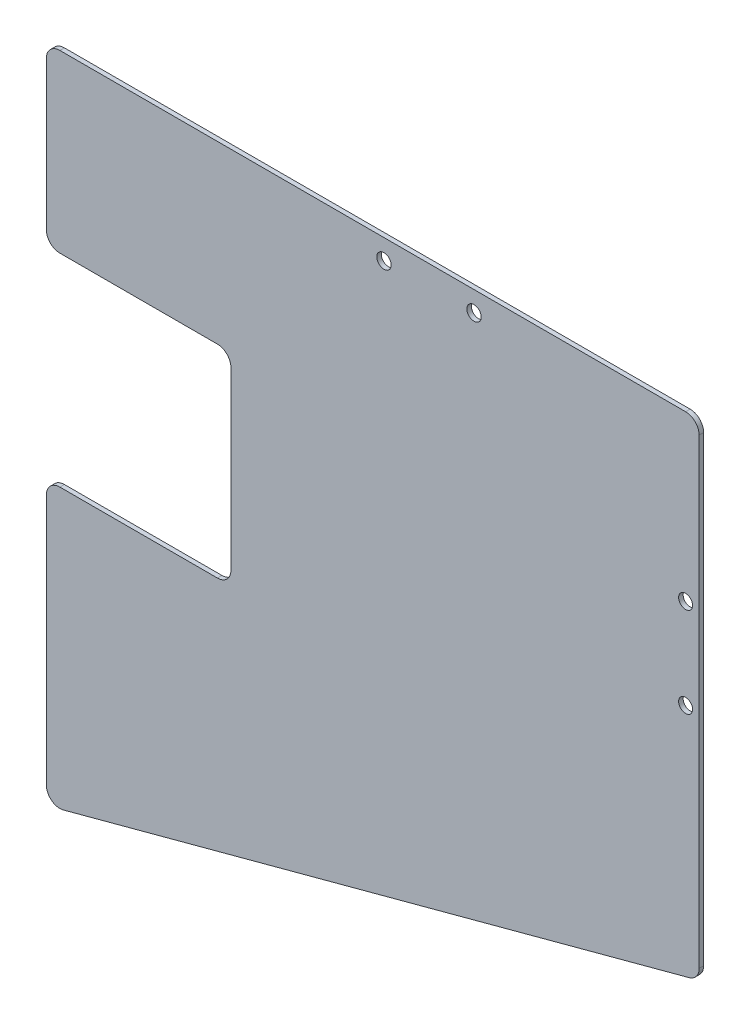
ISO-10303-21;
HEADER;
FILE_DESCRIPTION(('STEP AP214'),'2;1');
FILE_NAME('part.step','',(''),(''),'','','');
FILE_SCHEMA(('AUTOMOTIVE_DESIGN { 1 0 10303 214 1 1 1 1 }'));
ENDSEC;
DATA;
#1=APPLICATION_CONTEXT('core data for automotive mechanical design processes');
#2=APPLICATION_PROTOCOL_DEFINITION('international standard','automotive_design',2000,#1);
#3=PRODUCT_CONTEXT('',#1,'mechanical');
#4=PRODUCT('Part','Part','',(#3));
#5=PRODUCT_RELATED_PRODUCT_CATEGORY('part','',(#4));
#6=PRODUCT_DEFINITION_FORMATION('','',#4);
#7=PRODUCT_DEFINITION_CONTEXT('part definition',#1,'design');
#8=PRODUCT_DEFINITION('design','',#6,#7);
#9=PRODUCT_DEFINITION_SHAPE('','',#8);
#10=(LENGTH_UNIT() NAMED_UNIT(*) SI_UNIT(.MILLI.,.METRE.));
#11=(NAMED_UNIT(*) PLANE_ANGLE_UNIT() SI_UNIT($,.RADIAN.));
#12=(NAMED_UNIT(*) SI_UNIT($,.STERADIAN.) SOLID_ANGLE_UNIT());
#13=UNCERTAINTY_MEASURE_WITH_UNIT(LENGTH_MEASURE(1.E-05),#10,'distance_accuracy_value','');
#14=(GEOMETRIC_REPRESENTATION_CONTEXT(3) GLOBAL_UNCERTAINTY_ASSIGNED_CONTEXT((#13)) GLOBAL_UNIT_ASSIGNED_CONTEXT((#10,
#11,#12)) REPRESENTATION_CONTEXT('',''));
#15=CARTESIAN_POINT('',(0.,0.,0.));
#16=DIRECTION('',(0.,0.,1.));
#17=DIRECTION('',(1.,0.,0.));
#18=AXIS2_PLACEMENT_3D('',#15,#16,#17);
#19=CARTESIAN_POINT('',(-72.5,-76.,1.));
#20=DIRECTION('',(1.,0.,0.));
#21=DIRECTION('',(0.,0.,-1.));
#22=AXIS2_PLACEMENT_3D('',#19,#20,#21);
#23=PLANE('',#22);
#24=DIRECTION('',(0.,-1.,0.));
#25=VECTOR('',#24,1.);
#26=CARTESIAN_POINT('',(-72.5,-76.,1.));
#27=LINE('',#26,#25);
#28=CARTESIAN_POINT('',(-72.5,-11.,1.));
#29=VERTEX_POINT('',#28);
#30=CARTESIAN_POINT('',(-72.5,-66.8371282427541,1.));
#31=VERTEX_POINT('',#30);
#32=EDGE_CURVE('E197',#29,#31,#27,.T.);
#33=ORIENTED_EDGE('',*,*,#32,.F.);
#34=DIRECTION('',(0.,0.,-1.));
#35=VECTOR('',#34,1.);
#36=CARTESIAN_POINT('',(-72.5,-11.,1.));
#37=LINE('',#36,#35);
#38=CARTESIAN_POINT('',(-72.5,-11.,0.));
#39=VERTEX_POINT('',#38);
#40=EDGE_CURVE('E161',#29,#39,#37,.T.);
#41=ORIENTED_EDGE('',*,*,#40,.T.);
#42=DIRECTION('',(0.,-1.,0.));
#43=VECTOR('',#42,1.);
#44=CARTESIAN_POINT('',(-72.5,-76.,0.));
#45=LINE('',#44,#43);
#46=CARTESIAN_POINT('',(-72.5,-66.8371282427541,0.));
#47=VERTEX_POINT('',#46);
#48=EDGE_CURVE('E207',#39,#47,#45,.T.);
#49=ORIENTED_EDGE('',*,*,#48,.T.);
#50=DIRECTION('',(0.,0.,-1.));
#51=VECTOR('',#50,1.);
#52=CARTESIAN_POINT('',(-72.5,-66.8371282427541,1.));
#53=LINE('',#52,#51);
#54=EDGE_CURVE('E260',#47,#31,#53,.F.);
#55=ORIENTED_EDGE('',*,*,#54,.T.);
#56=EDGE_LOOP('',(#33,#41,#49,#55));
#57=FACE_BOUND('',#56,.T.);
#58=ADVANCED_FACE('F36',(#57),#23,.F.);
#59=CARTESIAN_POINT('',(72.5,-76.,1.));
#60=DIRECTION('',(-1.,0.,0.));
#61=DIRECTION('',(0.,0.,1.));
#62=AXIS2_PLACEMENT_3D('',#59,#60,#61);
#63=PLANE('',#62);
#64=DIRECTION('',(0.,1.,0.));
#65=VECTOR('',#64,1.);
#66=CARTESIAN_POINT('',(72.5,-76.,0.));
#67=LINE('',#66,#65);
#68=CARTESIAN_POINT('',(72.5,-29.5921904948328,0.));
#69=VERTEX_POINT('',#68);
#70=CARTESIAN_POINT('',(72.5,73.,0.));
#71=VERTEX_POINT('',#70);
#72=EDGE_CURVE('E201',#69,#71,#67,.T.);
#73=ORIENTED_EDGE('',*,*,#72,.T.);
#74=DIRECTION('',(0.,0.,-1.));
#75=VECTOR('',#74,1.);
#76=CARTESIAN_POINT('',(72.5,73.,1.));
#77=LINE('',#76,#75);
#78=CARTESIAN_POINT('',(72.5,73.,1.));
#79=VERTEX_POINT('',#78);
#80=EDGE_CURVE('E253',#71,#79,#77,.F.);
#81=ORIENTED_EDGE('',*,*,#80,.T.);
#82=DIRECTION('',(0.,1.,0.));
#83=VECTOR('',#82,1.);
#84=CARTESIAN_POINT('',(72.5,-76.,1.));
#85=LINE('',#84,#83);
#86=CARTESIAN_POINT('',(72.5,-29.5921904948328,1.));
#87=VERTEX_POINT('',#86);
#88=EDGE_CURVE('E192',#87,#79,#85,.T.);
#89=ORIENTED_EDGE('',*,*,#88,.F.);
#90=DIRECTION('',(0.,0.,-1.));
#91=VECTOR('',#90,1.);
#92=CARTESIAN_POINT('',(72.5,-29.5921904948328,1.));
#93=LINE('',#92,#91);
#94=EDGE_CURVE('E250',#87,#69,#93,.T.);
#95=ORIENTED_EDGE('',*,*,#94,.T.);
#96=EDGE_LOOP('',(#73,#81,#89,#95));
#97=FACE_BOUND('',#96,.T.);
#98=ADVANCED_FACE('F342',(#97),#63,.F.);
#99=CARTESIAN_POINT('',(-72.5,76.,1.));
#100=DIRECTION('',(0.,-1.,0.));
#101=DIRECTION('',(0.,0.,-1.));
#102=AXIS2_PLACEMENT_3D('',#99,#100,#101);
#103=PLANE('',#102);
#104=DIRECTION('',(-1.,0.,0.));
#105=VECTOR('',#104,1.);
#106=CARTESIAN_POINT('',(-72.5,76.,0.));
#107=LINE('',#106,#105);
#108=CARTESIAN_POINT('',(69.5,76.,0.));
#109=VERTEX_POINT('',#108);
#110=CARTESIAN_POINT('',(-69.5,76.,0.));
#111=VERTEX_POINT('',#110);
#112=EDGE_CURVE('E204',#109,#111,#107,.T.);
#113=ORIENTED_EDGE('',*,*,#112,.T.);
#114=DIRECTION('',(0.,0.,-1.));
#115=VECTOR('',#114,1.);
#116=CARTESIAN_POINT('',(-69.5,76.,1.));
#117=LINE('',#116,#115);
#118=CARTESIAN_POINT('',(-69.5,76.,1.));
#119=VERTEX_POINT('',#118);
#120=EDGE_CURVE('E51',#111,#119,#117,.F.);
#121=ORIENTED_EDGE('',*,*,#120,.T.);
#122=DIRECTION('',(-1.,0.,0.));
#123=VECTOR('',#122,1.);
#124=CARTESIAN_POINT('',(-72.5,76.,1.));
#125=LINE('',#124,#123);
#126=CARTESIAN_POINT('',(69.5,76.,1.));
#127=VERTEX_POINT('',#126);
#128=EDGE_CURVE('E194',#127,#119,#125,.T.);
#129=ORIENTED_EDGE('',*,*,#128,.F.);
#130=DIRECTION('',(0.,0.,-1.));
#131=VECTOR('',#130,1.);
#132=CARTESIAN_POINT('',(69.5,76.,1.));
#133=LINE('',#132,#131);
#134=EDGE_CURVE('E246',#127,#109,#133,.T.);
#135=ORIENTED_EDGE('',*,*,#134,.T.);
#136=EDGE_LOOP('',(#113,#121,#129,#135));
#137=FACE_BOUND('',#136,.T.);
#138=ADVANCED_FACE('F336',(#137),#103,.F.);
#139=CARTESIAN_POINT('',(-72.5,73.,0.));
#140=VERTEX_POINT('',#139);
#141=CARTESIAN_POINT('',(-72.5,40.,0.));
#142=VERTEX_POINT('',#141);
#143=EDGE_CURVE('E195',#140,#142,#45,.T.);
#144=ORIENTED_EDGE('',*,*,#143,.T.);
#145=DIRECTION('',(0.,0.,-1.));
#146=VECTOR('',#145,1.);
#147=CARTESIAN_POINT('',(-72.5,40.,1.));
#148=LINE('',#147,#146);
#149=CARTESIAN_POINT('',(-72.5,40.,1.));
#150=VERTEX_POINT('',#149);
#151=EDGE_CURVE('E233',#142,#150,#148,.F.);
#152=ORIENTED_EDGE('',*,*,#151,.T.);
#153=CARTESIAN_POINT('',(-72.5,73.,1.));
#154=VERTEX_POINT('',#153);
#155=EDGE_CURVE('E200',#154,#150,#27,.T.);
#156=ORIENTED_EDGE('',*,*,#155,.F.);
#157=DIRECTION('',(0.,0.,-1.));
#158=VECTOR('',#157,1.);
#159=CARTESIAN_POINT('',(-72.5,73.,1.));
#160=LINE('',#159,#158);
#161=EDGE_CURVE('E230',#154,#140,#160,.T.);
#162=ORIENTED_EDGE('',*,*,#161,.T.);
#163=EDGE_LOOP('',(#144,#152,#156,#162));
#164=FACE_BOUND('',#163,.T.);
#165=ADVANCED_FACE('F330',(#164),#23,.F.);
#166=CARTESIAN_POINT('',(0.,0.,1.));
#167=DIRECTION('',(0.,0.,-1.));
#168=DIRECTION('',(-1.,0.,0.));
#169=AXIS2_PLACEMENT_3D('',#166,#167,#168);
#170=PLANE('',#169);
#171=CARTESIAN_POINT('',(69.5,39.5,0.999999999999999));
#172=DIRECTION('',(0.,0.,-1.));
#173=DIRECTION('',(-1.,0.,0.));
#174=AXIS2_PLACEMENT_3D('',#171,#172,#173);
#175=CIRCLE('',#174,1.54999999999999);
#176=CARTESIAN_POINT('',(67.95,39.5,0.999999999999999));
#177=VERTEX_POINT('',#176);
#178=EDGE_CURVE('E292',#177,#177,#175,.T.);
#179=ORIENTED_EDGE('',*,*,#178,.T.);
#180=EDGE_LOOP('',(#179));
#181=FACE_BOUND('',#180,.T.);
#182=CARTESIAN_POINT('',(69.5,19.5,0.999999999999999));
#183=DIRECTION('',(0.,0.,-1.));
#184=DIRECTION('',(-1.,0.,0.));
#185=AXIS2_PLACEMENT_3D('',#182,#183,#184);
#186=CIRCLE('',#185,1.54999999999999);
#187=CARTESIAN_POINT('',(67.95,19.5,0.999999999999999));
#188=VERTEX_POINT('',#187);
#189=EDGE_CURVE('E299',#188,#188,#186,.T.);
#190=ORIENTED_EDGE('',*,*,#189,.T.);
#191=EDGE_LOOP('',(#190));
#192=FACE_BOUND('',#191,.T.);
#193=CARTESIAN_POINT('',(2.5,71.5,1.));
#194=DIRECTION('',(0.,0.,1.));
#195=DIRECTION('',(1.,0.,0.));
#196=AXIS2_PLACEMENT_3D('',#193,#194,#195);
#197=CIRCLE('',#196,1.6);
#198=CARTESIAN_POINT('',(4.1,71.5,1.));
#199=VERTEX_POINT('',#198);
#200=EDGE_CURVE('E185',#199,#199,#197,.T.);
#201=ORIENTED_EDGE('',*,*,#200,.F.);
#202=EDGE_LOOP('',(#201));
#203=FACE_BOUND('',#202,.T.);
#204=CARTESIAN_POINT('',(22.5,71.5,1.));
#205=DIRECTION('',(0.,0.,1.));
#206=DIRECTION('',(1.,0.,0.));
#207=AXIS2_PLACEMENT_3D('',#204,#205,#206);
#208=CIRCLE('',#207,1.60000000000001);
#209=CARTESIAN_POINT('',(24.1,71.5,1.));
#210=VERTEX_POINT('',#209);
#211=EDGE_CURVE('E288',#210,#210,#208,.T.);
#212=ORIENTED_EDGE('',*,*,#211,.F.);
#213=EDGE_LOOP('',(#212));
#214=FACE_BOUND('',#213,.T.);
#215=ORIENTED_EDGE('',*,*,#155,.T.);
#216=CARTESIAN_POINT('',(-69.5,40.,1.));
#217=DIRECTION('',(0.,0.,-1.));
#218=DIRECTION('',(-1.,0.,0.));
#219=AXIS2_PLACEMENT_3D('',#216,#217,#218);
#220=CIRCLE('',#219,3.);
#221=CARTESIAN_POINT('',(-69.5,37.,1.));
#222=VERTEX_POINT('',#221);
#223=EDGE_CURVE('E244',#150,#222,#220,.F.);
#224=ORIENTED_EDGE('',*,*,#223,.T.);
#225=DIRECTION('',(1.,0.,0.));
#226=VECTOR('',#225,1.);
#227=CARTESIAN_POINT('',(-72.5,37.,1.));
#228=LINE('',#227,#226);
#229=CARTESIAN_POINT('',(-34.4999999999971,37.,1.));
#230=VERTEX_POINT('',#229);
#231=EDGE_CURVE('E278',#222,#230,#228,.T.);
#232=ORIENTED_EDGE('',*,*,#231,.T.);
#233=CARTESIAN_POINT('',(-34.4999999999971,34.,1.));
#234=DIRECTION('',(0.,0.,-1.));
#235=DIRECTION('',(-1.,0.,0.));
#236=AXIS2_PLACEMENT_3D('',#233,#234,#235);
#237=CIRCLE('',#236,3.);
#238=CARTESIAN_POINT('',(-31.4999999999971,34.,1.));
#239=VERTEX_POINT('',#238);
#240=EDGE_CURVE('E11',#230,#239,#237,.T.);
#241=ORIENTED_EDGE('',*,*,#240,.T.);
#242=DIRECTION('',(0.,-1.,0.));
#243=VECTOR('',#242,1.);
#244=CARTESIAN_POINT('',(-31.4999999999971,37.,1.));
#245=LINE('',#244,#243);
#246=CARTESIAN_POINT('',(-31.4999999999971,-4.99999999999999,1.));
#247=VERTEX_POINT('',#246);
#248=EDGE_CURVE('E188',#239,#247,#245,.T.);
#249=ORIENTED_EDGE('',*,*,#248,.T.);
#250=CARTESIAN_POINT('',(-34.4999999999971,-5.,1.));
#251=DIRECTION('',(0.,0.,-1.));
#252=DIRECTION('',(-1.,0.,0.));
#253=AXIS2_PLACEMENT_3D('',#250,#251,#252);
#254=CIRCLE('',#253,3.);
#255=CARTESIAN_POINT('',(-34.4999999999971,-8.,1.));
#256=VERTEX_POINT('',#255);
#257=EDGE_CURVE('E160',#247,#256,#254,.T.);
#258=ORIENTED_EDGE('',*,*,#257,.T.);
#259=DIRECTION('',(-1.,0.,0.));
#260=VECTOR('',#259,1.);
#261=CARTESIAN_POINT('',(-31.4999999999971,-8.,1.));
#262=LINE('',#261,#260);
#263=CARTESIAN_POINT('',(-69.5,-8.,1.));
#264=VERTEX_POINT('',#263);
#265=EDGE_CURVE('E170',#256,#264,#262,.T.);
#266=ORIENTED_EDGE('',*,*,#265,.T.);
#267=CARTESIAN_POINT('',(-69.5,-11.,1.));
#268=DIRECTION('',(0.,0.,-1.));
#269=DIRECTION('',(-1.,0.,0.));
#270=AXIS2_PLACEMENT_3D('',#267,#268,#269);
#271=CIRCLE('',#270,3.);
#272=EDGE_CURVE('E237',#264,#29,#271,.F.);
#273=ORIENTED_EDGE('',*,*,#272,.T.);
#274=ORIENTED_EDGE('',*,*,#32,.T.);
#275=CARTESIAN_POINT('',(-69.5,-66.8371282427541,1.));
#276=DIRECTION('',(0.,0.,-1.));
#277=DIRECTION('',(-1.,0.,0.));
#278=AXIS2_PLACEMENT_3D('',#275,#276,#277);
#279=CIRCLE('',#278,3.);
#280=CARTESIAN_POINT('',(-68.7235428646925,-69.7349057216213,1.));
#281=VERTEX_POINT('',#280);
#282=EDGE_CURVE('E235',#31,#281,#279,.F.);
#283=ORIENTED_EDGE('',*,*,#282,.T.);
#284=DIRECTION('',(0.965925826289077,0.25881904510249,0.));
#285=VECTOR('',#284,1.);
#286=CARTESIAN_POINT('',(72.5,-31.8941714587698,1.));
#287=LINE('',#286,#285);
#288=CARTESIAN_POINT('',(70.2764571353075,-32.4899679737001,1.));
#289=VERTEX_POINT('',#288);
#290=EDGE_CURVE('E205',#281,#289,#287,.T.);
#291=ORIENTED_EDGE('',*,*,#290,.T.);
#292=CARTESIAN_POINT('',(69.5,-29.5921904948328,1.));
#293=DIRECTION('',(0.,0.,-1.));
#294=DIRECTION('',(-1.,0.,0.));
#295=AXIS2_PLACEMENT_3D('',#292,#293,#294);
#296=CIRCLE('',#295,3.);
#297=EDGE_CURVE('E239',#289,#87,#296,.F.);
#298=ORIENTED_EDGE('',*,*,#297,.T.);
#299=ORIENTED_EDGE('',*,*,#88,.T.);
#300=CARTESIAN_POINT('',(69.5,73.,1.));
#301=DIRECTION('',(0.,0.,-1.));
#302=DIRECTION('',(-1.,0.,0.));
#303=AXIS2_PLACEMENT_3D('',#300,#301,#302);
#304=CIRCLE('',#303,3.);
#305=EDGE_CURVE('E58',#79,#127,#304,.F.);
#306=ORIENTED_EDGE('',*,*,#305,.T.);
#307=ORIENTED_EDGE('',*,*,#128,.T.);
#308=CARTESIAN_POINT('',(-69.5,73.,1.));
#309=DIRECTION('',(0.,0.,-1.));
#310=DIRECTION('',(-1.,0.,0.));
#311=AXIS2_PLACEMENT_3D('',#308,#309,#310);
#312=CIRCLE('',#311,3.);
#313=EDGE_CURVE('E242',#119,#154,#312,.F.);
#314=ORIENTED_EDGE('',*,*,#313,.T.);
#315=EDGE_LOOP('',(#215,#224,#232,#241,#249,#258,#266,#273,#274,#283,#291,#298,#299,#306,#307,#314));
#316=FACE_BOUND('',#315,.T.);
#317=ADVANCED_FACE('F277',(#181,#192,#203,#214,#316),#170,.F.);
#318=CARTESIAN_POINT('',(0.,0.,0.));
#319=DIRECTION('',(0.,0.,-1.));
#320=DIRECTION('',(-1.,0.,0.));
#321=AXIS2_PLACEMENT_3D('',#318,#319,#320);
#322=PLANE('',#321);
#323=CARTESIAN_POINT('',(69.5,39.5,0.));
#324=DIRECTION('',(0.,0.,-1.));
#325=DIRECTION('',(-1.,0.,0.));
#326=AXIS2_PLACEMENT_3D('',#323,#324,#325);
#327=CIRCLE('',#326,1.54999999999999);
#328=CARTESIAN_POINT('',(67.95,39.5,0.));
#329=VERTEX_POINT('',#328);
#330=EDGE_CURVE('E302',#329,#329,#327,.T.);
#331=ORIENTED_EDGE('',*,*,#330,.F.);
#332=EDGE_LOOP('',(#331));
#333=FACE_BOUND('',#332,.T.);
#334=CARTESIAN_POINT('',(69.5,19.5,0.));
#335=DIRECTION('',(0.,0.,-1.));
#336=DIRECTION('',(-1.,0.,0.));
#337=AXIS2_PLACEMENT_3D('',#334,#335,#336);
#338=CIRCLE('',#337,1.54999999999999);
#339=CARTESIAN_POINT('',(67.95,19.5,0.));
#340=VERTEX_POINT('',#339);
#341=EDGE_CURVE('E303',#340,#340,#338,.T.);
#342=ORIENTED_EDGE('',*,*,#341,.F.);
#343=EDGE_LOOP('',(#342));
#344=FACE_BOUND('',#343,.T.);
#345=CARTESIAN_POINT('',(2.5,71.5,0.));
#346=DIRECTION('',(0.,0.,1.));
#347=DIRECTION('',(1.,0.,0.));
#348=AXIS2_PLACEMENT_3D('',#345,#346,#347);
#349=CIRCLE('',#348,1.6);
#350=CARTESIAN_POINT('',(4.1,71.5,0.));
#351=VERTEX_POINT('',#350);
#352=EDGE_CURVE('E179',#351,#351,#349,.T.);
#353=ORIENTED_EDGE('',*,*,#352,.T.);
#354=EDGE_LOOP('',(#353));
#355=FACE_BOUND('',#354,.T.);
#356=CARTESIAN_POINT('',(22.5,71.5,0.));
#357=DIRECTION('',(0.,0.,1.));
#358=DIRECTION('',(1.,0.,0.));
#359=AXIS2_PLACEMENT_3D('',#356,#357,#358);
#360=CIRCLE('',#359,1.60000000000001);
#361=CARTESIAN_POINT('',(24.1,71.5,0.));
#362=VERTEX_POINT('',#361);
#363=EDGE_CURVE('E291',#362,#362,#360,.T.);
#364=ORIENTED_EDGE('',*,*,#363,.T.);
#365=EDGE_LOOP('',(#364));
#366=FACE_BOUND('',#365,.T.);
#367=DIRECTION('',(1.,0.,0.));
#368=VECTOR('',#367,1.);
#369=CARTESIAN_POINT('',(-72.5,37.,0.));
#370=LINE('',#369,#368);
#371=CARTESIAN_POINT('',(-69.5,37.,0.));
#372=VERTEX_POINT('',#371);
#373=CARTESIAN_POINT('',(-34.4999999999971,37.,0.));
#374=VERTEX_POINT('',#373);
#375=EDGE_CURVE('E178',#372,#374,#370,.T.);
#376=ORIENTED_EDGE('',*,*,#375,.F.);
#377=CARTESIAN_POINT('',(-69.5,40.,0.));
#378=DIRECTION('',(0.,0.,-1.));
#379=DIRECTION('',(-1.,0.,0.));
#380=AXIS2_PLACEMENT_3D('',#377,#378,#379);
#381=CIRCLE('',#380,3.);
#382=EDGE_CURVE('E228',#372,#142,#381,.T.);
#383=ORIENTED_EDGE('',*,*,#382,.T.);
#384=ORIENTED_EDGE('',*,*,#143,.F.);
#385=CARTESIAN_POINT('',(-69.5,73.,0.));
#386=DIRECTION('',(0.,0.,-1.));
#387=DIRECTION('',(-1.,0.,0.));
#388=AXIS2_PLACEMENT_3D('',#385,#386,#387);
#389=CIRCLE('',#388,3.);
#390=EDGE_CURVE('E226',#140,#111,#389,.T.);
#391=ORIENTED_EDGE('',*,*,#390,.T.);
#392=ORIENTED_EDGE('',*,*,#112,.F.);
#393=CARTESIAN_POINT('',(69.5,73.,0.));
#394=DIRECTION('',(0.,0.,-1.));
#395=DIRECTION('',(-1.,0.,0.));
#396=AXIS2_PLACEMENT_3D('',#393,#394,#395);
#397=CIRCLE('',#396,3.);
#398=EDGE_CURVE('E224',#109,#71,#397,.T.);
#399=ORIENTED_EDGE('',*,*,#398,.T.);
#400=ORIENTED_EDGE('',*,*,#72,.F.);
#401=CARTESIAN_POINT('',(69.5,-29.5921904948328,0.));
#402=DIRECTION('',(0.,0.,-1.));
#403=DIRECTION('',(-1.,0.,0.));
#404=AXIS2_PLACEMENT_3D('',#401,#402,#403);
#405=CIRCLE('',#404,3.);
#406=CARTESIAN_POINT('',(70.2764571353075,-32.4899679737001,0.));
#407=VERTEX_POINT('',#406);
#408=EDGE_CURVE('E222',#69,#407,#405,.T.);
#409=ORIENTED_EDGE('',*,*,#408,.T.);
#410=DIRECTION('',(0.965925826289077,0.25881904510249,0.));
#411=VECTOR('',#410,1.);
#412=CARTESIAN_POINT('',(72.5,-31.8941714587698,0.));
#413=LINE('',#412,#411);
#414=CARTESIAN_POINT('',(-68.7235428646925,-69.7349057216213,0.));
#415=VERTEX_POINT('',#414);
#416=EDGE_CURVE('E281',#415,#407,#413,.T.);
#417=ORIENTED_EDGE('',*,*,#416,.F.);
#418=CARTESIAN_POINT('',(-69.5,-66.8371282427541,0.));
#419=DIRECTION('',(0.,0.,-1.));
#420=DIRECTION('',(-1.,0.,0.));
#421=AXIS2_PLACEMENT_3D('',#418,#419,#420);
#422=CIRCLE('',#421,3.);
#423=EDGE_CURVE('E219',#415,#47,#422,.T.);
#424=ORIENTED_EDGE('',*,*,#423,.T.);
#425=ORIENTED_EDGE('',*,*,#48,.F.);
#426=CARTESIAN_POINT('',(-69.5,-11.,0.));
#427=DIRECTION('',(0.,0.,-1.));
#428=DIRECTION('',(-1.,0.,0.));
#429=AXIS2_PLACEMENT_3D('',#426,#427,#428);
#430=CIRCLE('',#429,3.);
#431=CARTESIAN_POINT('',(-69.5,-8.,0.));
#432=VERTEX_POINT('',#431);
#433=EDGE_CURVE('E177',#39,#432,#430,.T.);
#434=ORIENTED_EDGE('',*,*,#433,.T.);
#435=DIRECTION('',(-1.,0.,0.));
#436=VECTOR('',#435,1.);
#437=CARTESIAN_POINT('',(-31.4999999999971,-8.,0.));
#438=LINE('',#437,#436);
#439=CARTESIAN_POINT('',(-34.4999999999971,-8.,0.));
#440=VERTEX_POINT('',#439);
#441=EDGE_CURVE('E167',#440,#432,#438,.T.);
#442=ORIENTED_EDGE('',*,*,#441,.F.);
#443=CARTESIAN_POINT('',(-34.4999999999971,-5.,0.));
#444=DIRECTION('',(0.,0.,-1.));
#445=DIRECTION('',(-1.,0.,0.));
#446=AXIS2_PLACEMENT_3D('',#443,#444,#445);
#447=CIRCLE('',#446,3.);
#448=CARTESIAN_POINT('',(-31.4999999999971,-4.99999999999999,0.));
#449=VERTEX_POINT('',#448);
#450=EDGE_CURVE('E150',#440,#449,#447,.F.);
#451=ORIENTED_EDGE('',*,*,#450,.T.);
#452=DIRECTION('',(0.,-1.,0.));
#453=VECTOR('',#452,1.);
#454=CARTESIAN_POINT('',(-31.4999999999971,37.,0.));
#455=LINE('',#454,#453);
#456=CARTESIAN_POINT('',(-31.4999999999971,34.,0.));
#457=VERTEX_POINT('',#456);
#458=EDGE_CURVE('E182',#457,#449,#455,.T.);
#459=ORIENTED_EDGE('',*,*,#458,.F.);
#460=CARTESIAN_POINT('',(-34.4999999999971,34.,0.));
#461=DIRECTION('',(0.,0.,-1.));
#462=DIRECTION('',(-1.,0.,0.));
#463=AXIS2_PLACEMENT_3D('',#460,#461,#462);
#464=CIRCLE('',#463,3.);
#465=EDGE_CURVE('E44',#457,#374,#464,.F.);
#466=ORIENTED_EDGE('',*,*,#465,.T.);
#467=EDGE_LOOP('',(#376,#383,#384,#391,#392,#399,#400,#409,#417,#424,#425,#434,#442,#451,#459,#466));
#468=FACE_BOUND('',#467,.T.);
#469=ADVANCED_FACE('F175',(#333,#344,#355,#366,#468),#322,.T.);
#470=CARTESIAN_POINT('',(-31.4999999999971,-8.,1.));
#471=DIRECTION('',(0.,-1.,0.));
#472=DIRECTION('',(0.,0.,-1.));
#473=AXIS2_PLACEMENT_3D('',#470,#471,#472);
#474=PLANE('',#473);
#475=ORIENTED_EDGE('',*,*,#265,.F.);
#476=DIRECTION('',(0.,0.,-1.));
#477=VECTOR('',#476,1.);
#478=CARTESIAN_POINT('',(-34.4999999999971,-8.,0.));
#479=LINE('',#478,#477);
#480=EDGE_CURVE('E154',#256,#440,#479,.T.);
#481=ORIENTED_EDGE('',*,*,#480,.T.);
#482=ORIENTED_EDGE('',*,*,#441,.T.);
#483=DIRECTION('',(0.,0.,-1.));
#484=VECTOR('',#483,1.);
#485=CARTESIAN_POINT('',(-69.5,-8.,1.));
#486=LINE('',#485,#484);
#487=EDGE_CURVE('E172',#432,#264,#486,.F.);
#488=ORIENTED_EDGE('',*,*,#487,.T.);
#489=EDGE_LOOP('',(#475,#481,#482,#488));
#490=FACE_BOUND('',#489,.T.);
#491=ADVANCED_FACE('F166',(#490),#474,.F.);
#492=CARTESIAN_POINT('',(-31.4999999999971,37.,1.));
#493=DIRECTION('',(1.,0.,0.));
#494=DIRECTION('',(0.,1.,0.));
#495=AXIS2_PLACEMENT_3D('',#492,#493,#494);
#496=PLANE('',#495);
#497=ORIENTED_EDGE('',*,*,#458,.T.);
#498=DIRECTION('',(0.,0.,-1.));
#499=VECTOR('',#498,1.);
#500=CARTESIAN_POINT('',(-31.4999999999971,-5.,1.));
#501=LINE('',#500,#499);
#502=EDGE_CURVE('E155',#449,#247,#501,.F.);
#503=ORIENTED_EDGE('',*,*,#502,.T.);
#504=ORIENTED_EDGE('',*,*,#248,.F.);
#505=DIRECTION('',(0.,0.,-1.));
#506=VECTOR('',#505,1.);
#507=CARTESIAN_POINT('',(-31.4999999999971,34.,0.));
#508=LINE('',#507,#506);
#509=EDGE_CURVE('E171',#239,#457,#508,.T.);
#510=ORIENTED_EDGE('',*,*,#509,.T.);
#511=EDGE_LOOP('',(#497,#503,#504,#510));
#512=FACE_BOUND('',#511,.T.);
#513=ADVANCED_FACE('F280',(#512),#496,.F.);
#514=CARTESIAN_POINT('',(-72.5,37.,1.));
#515=DIRECTION('',(0.,1.,0.));
#516=DIRECTION('',(-1.,0.,0.));
#517=AXIS2_PLACEMENT_3D('',#514,#515,#516);
#518=PLANE('',#517);
#519=ORIENTED_EDGE('',*,*,#375,.T.);
#520=DIRECTION('',(0.,0.,-1.));
#521=VECTOR('',#520,1.);
#522=CARTESIAN_POINT('',(-34.4999999999971,37.,1.));
#523=LINE('',#522,#521);
#524=EDGE_CURVE('E217',#374,#230,#523,.F.);
#525=ORIENTED_EDGE('',*,*,#524,.T.);
#526=ORIENTED_EDGE('',*,*,#231,.F.);
#527=DIRECTION('',(0.,0.,-1.));
#528=VECTOR('',#527,1.);
#529=CARTESIAN_POINT('',(-69.5,37.,1.));
#530=LINE('',#529,#528);
#531=EDGE_CURVE('E214',#222,#372,#530,.T.);
#532=ORIENTED_EDGE('',*,*,#531,.T.);
#533=EDGE_LOOP('',(#519,#525,#526,#532));
#534=FACE_BOUND('',#533,.T.);
#535=ADVANCED_FACE('F268',(#534),#518,.F.);
#536=CARTESIAN_POINT('',(72.5,-31.8941714587698,1.));
#537=DIRECTION('',(-0.25881904510249,0.965925826289077,0.));
#538=DIRECTION('',(-0.965925826289077,-0.25881904510249,0.));
#539=AXIS2_PLACEMENT_3D('',#536,#537,#538);
#540=PLANE('',#539);
#541=ORIENTED_EDGE('',*,*,#416,.T.);
#542=DIRECTION('',(0.,0.,-1.));
#543=VECTOR('',#542,1.);
#544=CARTESIAN_POINT('',(70.2764571353075,-32.4899679737001,1.));
#545=LINE('',#544,#543);
#546=EDGE_CURVE('E258',#407,#289,#545,.F.);
#547=ORIENTED_EDGE('',*,*,#546,.T.);
#548=ORIENTED_EDGE('',*,*,#290,.F.);
#549=DIRECTION('',(0.,0.,-1.));
#550=VECTOR('',#549,1.);
#551=CARTESIAN_POINT('',(-68.7235428646925,-69.7349057216213,1.));
#552=LINE('',#551,#550);
#553=EDGE_CURVE('E255',#281,#415,#552,.T.);
#554=ORIENTED_EDGE('',*,*,#553,.T.);
#555=EDGE_LOOP('',(#541,#547,#548,#554));
#556=FACE_BOUND('',#555,.T.);
#557=ADVANCED_FACE('F325',(#556),#540,.F.);
#558=CARTESIAN_POINT('',(22.5,71.5,0.));
#559=DIRECTION('',(0.,0.,1.));
#560=DIRECTION('',(1.,0.,0.));
#561=AXIS2_PLACEMENT_3D('',#558,#559,#560);
#562=CYLINDRICAL_SURFACE('',#561,1.60000000000001);
#563=ORIENTED_EDGE('',*,*,#363,.F.);
#564=EDGE_LOOP('',(#563));
#565=FACE_BOUND('',#564,.T.);
#566=ORIENTED_EDGE('',*,*,#211,.T.);
#567=EDGE_LOOP('',(#566));
#568=FACE_BOUND('',#567,.T.);
#569=ADVANCED_FACE('F321',(#565,#568),#562,.F.);
#570=CARTESIAN_POINT('',(2.5,71.5,0.));
#571=DIRECTION('',(0.,0.,1.));
#572=DIRECTION('',(1.,0.,0.));
#573=AXIS2_PLACEMENT_3D('',#570,#571,#572);
#574=CYLINDRICAL_SURFACE('',#573,1.6);
#575=ORIENTED_EDGE('',*,*,#352,.F.);
#576=EDGE_LOOP('',(#575));
#577=FACE_BOUND('',#576,.T.);
#578=ORIENTED_EDGE('',*,*,#200,.T.);
#579=EDGE_LOOP('',(#578));
#580=FACE_BOUND('',#579,.T.);
#581=ADVANCED_FACE('F324',(#577,#580),#574,.F.);
#582=CARTESIAN_POINT('',(-34.4999999999971,-5.,1.));
#583=DIRECTION('',(0.,0.,1.));
#584=DIRECTION('',(1.,0.,0.));
#585=AXIS2_PLACEMENT_3D('',#582,#583,#584);
#586=CYLINDRICAL_SURFACE('',#585,3.);
#587=ORIENTED_EDGE('',*,*,#257,.F.);
#588=ORIENTED_EDGE('',*,*,#502,.F.);
#589=ORIENTED_EDGE('',*,*,#450,.F.);
#590=ORIENTED_EDGE('',*,*,#480,.F.);
#591=EDGE_LOOP('',(#587,#588,#589,#590));
#592=FACE_BOUND('',#591,.T.);
#593=ADVANCED_FACE('F153',(#592),#586,.F.);
#594=CARTESIAN_POINT('',(-34.4999999999971,34.,1.));
#595=DIRECTION('',(0.,0.,1.));
#596=DIRECTION('',(1.,0.,0.));
#597=AXIS2_PLACEMENT_3D('',#594,#595,#596);
#598=CYLINDRICAL_SURFACE('',#597,3.);
#599=ORIENTED_EDGE('',*,*,#240,.F.);
#600=ORIENTED_EDGE('',*,*,#524,.F.);
#601=ORIENTED_EDGE('',*,*,#465,.F.);
#602=ORIENTED_EDGE('',*,*,#509,.F.);
#603=EDGE_LOOP('',(#599,#600,#601,#602));
#604=FACE_BOUND('',#603,.T.);
#605=ADVANCED_FACE('F273',(#604),#598,.F.);
#606=CARTESIAN_POINT('',(-69.5,40.,1.));
#607=DIRECTION('',(0.,0.,-1.));
#608=DIRECTION('',(-1.,0.,0.));
#609=AXIS2_PLACEMENT_3D('',#606,#607,#608);
#610=CYLINDRICAL_SURFACE('',#609,3.);
#611=ORIENTED_EDGE('',*,*,#223,.F.);
#612=ORIENTED_EDGE('',*,*,#151,.F.);
#613=ORIENTED_EDGE('',*,*,#382,.F.);
#614=ORIENTED_EDGE('',*,*,#531,.F.);
#615=EDGE_LOOP('',(#611,#612,#613,#614));
#616=FACE_BOUND('',#615,.T.);
#617=ADVANCED_FACE('F357',(#616),#610,.T.);
#618=CARTESIAN_POINT('',(-69.5,73.,1.));
#619=DIRECTION('',(0.,0.,-1.));
#620=DIRECTION('',(-1.,0.,0.));
#621=AXIS2_PLACEMENT_3D('',#618,#619,#620);
#622=CYLINDRICAL_SURFACE('',#621,3.);
#623=ORIENTED_EDGE('',*,*,#313,.F.);
#624=ORIENTED_EDGE('',*,*,#120,.F.);
#625=ORIENTED_EDGE('',*,*,#390,.F.);
#626=ORIENTED_EDGE('',*,*,#161,.F.);
#627=EDGE_LOOP('',(#623,#624,#625,#626));
#628=FACE_BOUND('',#627,.T.);
#629=ADVANCED_FACE('F360',(#628),#622,.T.);
#630=CARTESIAN_POINT('',(69.5,73.,1.));
#631=DIRECTION('',(0.,0.,-1.));
#632=DIRECTION('',(-1.,0.,0.));
#633=AXIS2_PLACEMENT_3D('',#630,#631,#632);
#634=CYLINDRICAL_SURFACE('',#633,3.);
#635=ORIENTED_EDGE('',*,*,#305,.F.);
#636=ORIENTED_EDGE('',*,*,#80,.F.);
#637=ORIENTED_EDGE('',*,*,#398,.F.);
#638=ORIENTED_EDGE('',*,*,#134,.F.);
#639=EDGE_LOOP('',(#635,#636,#637,#638));
#640=FACE_BOUND('',#639,.T.);
#641=ADVANCED_FACE('F364',(#640),#634,.T.);
#642=CARTESIAN_POINT('',(69.5,-29.5921904948328,1.));
#643=DIRECTION('',(0.,0.,-1.));
#644=DIRECTION('',(-1.,0.,0.));
#645=AXIS2_PLACEMENT_3D('',#642,#643,#644);
#646=CYLINDRICAL_SURFACE('',#645,3.);
#647=ORIENTED_EDGE('',*,*,#297,.F.);
#648=ORIENTED_EDGE('',*,*,#546,.F.);
#649=ORIENTED_EDGE('',*,*,#408,.F.);
#650=ORIENTED_EDGE('',*,*,#94,.F.);
#651=EDGE_LOOP('',(#647,#648,#649,#650));
#652=FACE_BOUND('',#651,.T.);
#653=ADVANCED_FACE('F368',(#652),#646,.T.);
#654=CARTESIAN_POINT('',(-69.5,-11.,1.));
#655=DIRECTION('',(0.,0.,-1.));
#656=DIRECTION('',(-1.,0.,0.));
#657=AXIS2_PLACEMENT_3D('',#654,#655,#656);
#658=CYLINDRICAL_SURFACE('',#657,3.);
#659=ORIENTED_EDGE('',*,*,#272,.F.);
#660=ORIENTED_EDGE('',*,*,#487,.F.);
#661=ORIENTED_EDGE('',*,*,#433,.F.);
#662=ORIENTED_EDGE('',*,*,#40,.F.);
#663=EDGE_LOOP('',(#659,#660,#661,#662));
#664=FACE_BOUND('',#663,.T.);
#665=ADVANCED_FACE('F371',(#664),#658,.T.);
#666=CARTESIAN_POINT('',(-69.5,-66.8371282427541,1.));
#667=DIRECTION('',(0.,0.,-1.));
#668=DIRECTION('',(-1.,0.,0.));
#669=AXIS2_PLACEMENT_3D('',#666,#667,#668);
#670=CYLINDRICAL_SURFACE('',#669,3.);
#671=ORIENTED_EDGE('',*,*,#282,.F.);
#672=ORIENTED_EDGE('',*,*,#54,.F.);
#673=ORIENTED_EDGE('',*,*,#423,.F.);
#674=ORIENTED_EDGE('',*,*,#553,.F.);
#675=EDGE_LOOP('',(#671,#672,#673,#674));
#676=FACE_BOUND('',#675,.T.);
#677=ADVANCED_FACE('F38',(#676),#670,.T.);
#678=CARTESIAN_POINT('',(69.5,19.5,10.));
#679=DIRECTION('',(0.,0.,-1.));
#680=DIRECTION('',(-1.,0.,0.));
#681=AXIS2_PLACEMENT_3D('',#678,#679,#680);
#682=CYLINDRICAL_SURFACE('',#681,1.54999999999999);
#683=ORIENTED_EDGE('',*,*,#341,.T.);
#684=EDGE_LOOP('',(#683));
#685=FACE_BOUND('',#684,.T.);
#686=ORIENTED_EDGE('',*,*,#189,.F.);
#687=EDGE_LOOP('',(#686));
#688=FACE_BOUND('',#687,.T.);
#689=ADVANCED_FACE('F378',(#685,#688),#682,.F.);
#690=CARTESIAN_POINT('',(69.5,39.5,10.));
#691=DIRECTION('',(0.,0.,-1.));
#692=DIRECTION('',(-1.,0.,0.));
#693=AXIS2_PLACEMENT_3D('',#690,#691,#692);
#694=CYLINDRICAL_SURFACE('',#693,1.54999999999999);
#695=ORIENTED_EDGE('',*,*,#330,.T.);
#696=EDGE_LOOP('',(#695));
#697=FACE_BOUND('',#696,.T.);
#698=ORIENTED_EDGE('',*,*,#178,.F.);
#699=EDGE_LOOP('',(#698));
#700=FACE_BOUND('',#699,.T.);
#701=ADVANCED_FACE('F309',(#697,#700),#694,.F.);
#702=CLOSED_SHELL('',(#58,#98,#138,#165,#317,#469,#491,#513,#535,#557,#569,#581,#593,#605,#617,
#629,#641,#653,#665,#677,#689,#701));
#703=MANIFOLD_SOLID_BREP('B2',#702);
#704=ADVANCED_BREP_SHAPE_REPRESENTATION('',(#18,#703),#14);
#705=SHAPE_DEFINITION_REPRESENTATION(#9,#704);
ENDSEC;
END-ISO-10303-21;
